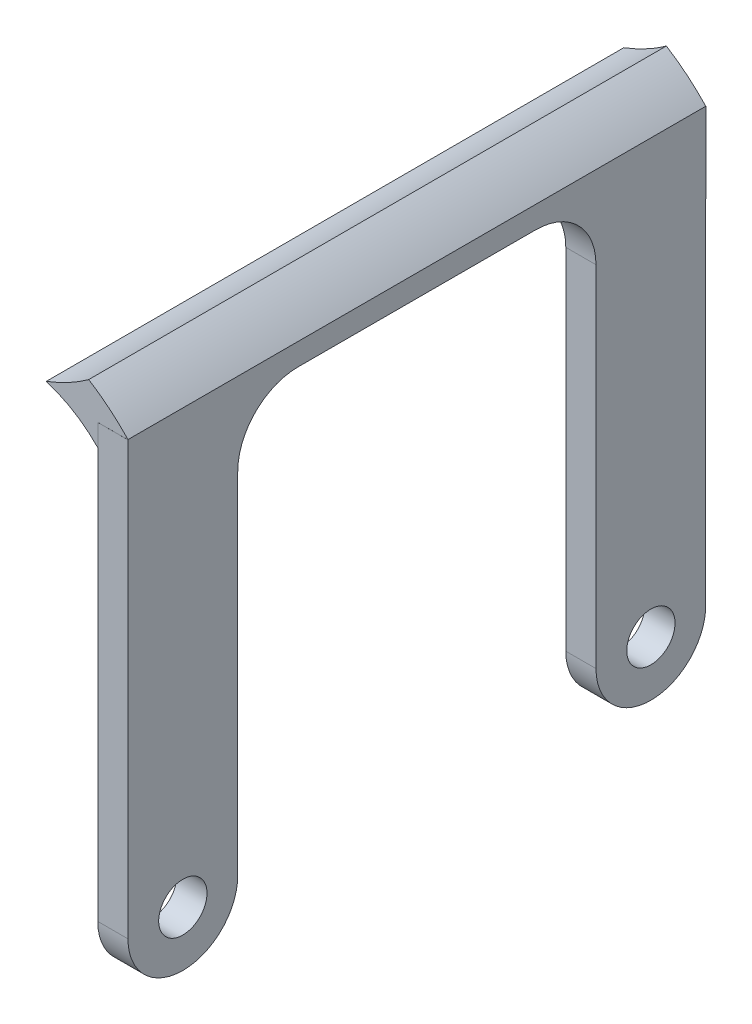
ISO-10303-21;
HEADER;
FILE_DESCRIPTION(('STEP AP214'),'2;1');
FILE_NAME('part.step','',(''),(''),'','','');
FILE_SCHEMA(('AUTOMOTIVE_DESIGN { 1 0 10303 214 1 1 1 1 }'));
ENDSEC;
DATA;
#1=APPLICATION_CONTEXT('core data for automotive mechanical design processes');
#2=APPLICATION_PROTOCOL_DEFINITION('international standard','automotive_design',2000,#1);
#3=PRODUCT_CONTEXT('',#1,'mechanical');
#4=PRODUCT('Part','Part','',(#3));
#5=PRODUCT_RELATED_PRODUCT_CATEGORY('part','',(#4));
#6=PRODUCT_DEFINITION_FORMATION('','',#4);
#7=PRODUCT_DEFINITION_CONTEXT('part definition',#1,'design');
#8=PRODUCT_DEFINITION('design','',#6,#7);
#9=PRODUCT_DEFINITION_SHAPE('','',#8);
#10=(LENGTH_UNIT() NAMED_UNIT(*) SI_UNIT(.MILLI.,.METRE.));
#11=(NAMED_UNIT(*) PLANE_ANGLE_UNIT() SI_UNIT($,.RADIAN.));
#12=(NAMED_UNIT(*) SI_UNIT($,.STERADIAN.) SOLID_ANGLE_UNIT());
#13=UNCERTAINTY_MEASURE_WITH_UNIT(LENGTH_MEASURE(1.E-05),#10,'distance_accuracy_value','');
#14=(GEOMETRIC_REPRESENTATION_CONTEXT(3) GLOBAL_UNCERTAINTY_ASSIGNED_CONTEXT((#13)) GLOBAL_UNIT_ASSIGNED_CONTEXT((#10,
#11,#12)) REPRESENTATION_CONTEXT('',''));
#15=CARTESIAN_POINT('',(0.,0.,0.));
#16=DIRECTION('',(0.,0.,1.));
#17=DIRECTION('',(1.,0.,0.));
#18=AXIS2_PLACEMENT_3D('',#15,#16,#17);
#19=CARTESIAN_POINT('',(0.,0.,45.));
#20=DIRECTION('',(0.,0.,-1.));
#21=DIRECTION('',(-1.,0.,0.));
#22=AXIS2_PLACEMENT_3D('',#19,#20,#21);
#23=CYLINDRICAL_SURFACE('',#22,12.);
#24=CARTESIAN_POINT('',(7.02498383519469,-9.72880302073987,3.36314771253102));
#25=CARTESIAN_POINT('',(7.02723049262112,-9.72718058034893,11.3631472325452));
#26=CARTESIAN_POINT('',(7.0294756204064,-9.72555812868285,19.3631467529861));
#27=CARTESIAN_POINT('',(7.03305322480976,-9.72297097617606,32.1198133545629));
#28=CARTESIAN_POINT('',(7.0343866902958,-9.72200628262441,36.8764804354229));
#29=CARTESIAN_POINT('',(7.03571961500865,-9.72104158508667,41.6331475164338));
#30=B_SPLINE_CURVE_WITH_KNOTS('',3,(#24,#25,#26,#27,#28,#29),.UNSPECIFIED.,.F.,.F.,(4,2,4),(0.,
24.0000000000005,38.2700020967807),.UNSPECIFIED.);
#31=CARTESIAN_POINT('',(7.02498360255062,-9.72880287516892,3.36314771247591));
#32=VERTEX_POINT('',#31);
#33=CARTESIAN_POINT('',(7.03571984585373,-9.72104172984277,41.6331475163984));
#34=VERTEX_POINT('',#33);
#35=EDGE_CURVE('E256',#32,#34,#30,.T.);
#36=ORIENTED_EDGE('',*,*,#35,.F.);
#37=CARTESIAN_POINT('',(0.,0.,3.35946508146585));
#38=DIRECTION('',(0.,0.000378528663133396,0.999999928358023));
#39=DIRECTION('',(0.,0.999999928358023,-0.000378528663133396));
#40=AXIS2_PLACEMENT_3D('',#37,#38,#39);
#41=ELLIPSE('',#40,12.0000008597038,12.);
#42=CARTESIAN_POINT('',(4.19954878426392,-11.2411649755969,3.36372018492097));
#43=VERTEX_POINT('',#42);
#44=EDGE_CURVE('E11',#32,#43,#41,.F.);
#45=ORIENTED_EDGE('',*,*,#44,.T.);
#46=CARTESIAN_POINT('',(4.22082501140202,-11.2331939469583,41.6337199093966));
#47=CARTESIAN_POINT('',(4.2178458420291,-11.2343131549428,36.2549856274687));
#48=CARTESIAN_POINT('',(4.21486197520819,-11.2354328251756,30.8762513482478));
#49=CARTESIAN_POINT('',(4.2077740403963,-11.23808942724,18.1195847711701));
#50=CARTESIAN_POINT('',(4.20366583150458,-11.2396267665534,10.7416524756996));
#51=CARTESIAN_POINT('',(4.19954878426414,-11.2411649755969,3.36372018532252));
#52=B_SPLINE_CURVE_WITH_KNOTS('',3,(#46,#47,#48,#49,#50,#51),.UNSPECIFIED.,.F.,.F.,(4,2,4),(0.,
16.1362056702403,38.2700064684776),.UNSPECIFIED.);
#53=CARTESIAN_POINT('',(4.22082501140202,-11.2331939469583,41.6337199093966));
#54=VERTEX_POINT('',#53);
#55=EDGE_CURVE('E50',#54,#43,#52,.T.);
#56=ORIENTED_EDGE('',*,*,#55,.F.);
#57=CARTESIAN_POINT('',(0.,0.,41.6294678232045));
#58=DIRECTION('',(0.,0.000378528663133396,0.999999928358023));
#59=DIRECTION('',(0.,0.999999928358023,-0.000378528663133396));
#60=AXIS2_PLACEMENT_3D('',#57,#58,#59);
#61=ELLIPSE('',#60,12.0000008597038,12.);
#62=EDGE_CURVE('E38',#34,#54,#61,.F.);
#63=ORIENTED_EDGE('',*,*,#62,.F.);
#64=EDGE_LOOP('',(#36,#45,#56,#63));
#65=FACE_BOUND('',#64,.T.);
#66=ADVANCED_FACE('F34',(#65),#23,.F.);
#67=CARTESIAN_POINT('',(0.0730357292681935,-20.8245636403161,41.6373505180044));
#68=DIRECTION('',(0.,-0.000378528663133396,-0.999999928358023));
#69=DIRECTION('',(0.,0.999999928358023,-0.000378528663133396));
#70=AXIS2_PLACEMENT_3D('',#67,#68,#69);
#71=CYLINDRICAL_SURFACE('',#70,13.1059981149448);
#72=CARTESIAN_POINT('',(0.0730357292681935,-20.8390499322542,3.36735325974281));
#73=DIRECTION('',(0.,-0.000378528663133396,-0.999999928358023));
#74=DIRECTION('',(0.,-0.999999928358023,0.000378528663133396));
#75=AXIS2_PLACEMENT_3D('',#72,#73,#74);
#76=CIRCLE('',#75,13.1059981149448);
#77=CARTESIAN_POINT('',(9.63633012475503,-11.8774331480479,3.36396103067894));
#78=VERTEX_POINT('',#77);
#79=EDGE_CURVE('E170',#32,#78,#76,.T.);
#80=ORIENTED_EDGE('',*,*,#79,.F.);
#81=ORIENTED_EDGE('',*,*,#35,.T.);
#82=CARTESIAN_POINT('',(0.0730357292681935,-20.8245636403161,41.6373505180044));
#83=DIRECTION('',(0.,-0.000378528663133396,-0.999999928358023));
#84=DIRECTION('',(0.,-0.999999928358023,0.000378528663133396));
#85=AXIS2_PLACEMENT_3D('',#82,#83,#84);
#86=CIRCLE('',#85,13.1059981149448);
#87=CARTESIAN_POINT('',(9.63633012475503,-11.8629468561098,41.6339582889405));
#88=VERTEX_POINT('',#87);
#89=EDGE_CURVE('E171',#34,#88,#86,.T.);
#90=ORIENTED_EDGE('',*,*,#89,.T.);
#91=DIRECTION('',(0.,-0.000378528663133396,-0.999999928358023));
#92=VECTOR('',#91,1.);
#93=CARTESIAN_POINT('',(9.63633012475503,-11.8629468561098,41.6339582889405));
#94=LINE('',#93,#92);
#95=EDGE_CURVE('E179',#88,#78,#94,.T.);
#96=ORIENTED_EDGE('',*,*,#95,.T.);
#97=EDGE_LOOP('',(#80,#81,#90,#96));
#98=FACE_BOUND('',#97,.T.);
#99=ADVANCED_FACE('F268',(#98),#71,.T.);
#100=CARTESIAN_POINT('',(1.8478331682223,-18.9444314968007,41.6366388340466));
#101=DIRECTION('',(0.,-0.000378528663133396,-0.999999928358023));
#102=DIRECTION('',(0.,0.999999928358023,-0.000378528663133396));
#103=AXIS2_PLACEMENT_3D('',#100,#101,#102);
#104=CYLINDRICAL_SURFACE('',#103,8.06810283511668);
#105=CARTESIAN_POINT('',(1.8478331682223,-18.9444314968007,41.6366388340466));
#106=DIRECTION('',(0.,0.000378528663133396,0.999999928358023));
#107=DIRECTION('',(0.,0.999999928358023,-0.000378528663133396));
#108=AXIS2_PLACEMENT_3D('',#105,#106,#107);
#109=CIRCLE('',#108,8.06810283511668);
#110=CARTESIAN_POINT('',(7.63633012475503,-13.3241484241935,41.6345113956562));
#111=VERTEX_POINT('',#110);
#112=EDGE_CURVE('E177',#111,#54,#109,.T.);
#113=ORIENTED_EDGE('',*,*,#112,.T.);
#114=ORIENTED_EDGE('',*,*,#55,.T.);
#115=CARTESIAN_POINT('',(1.8478331682223,-18.9589177887388,3.36664157578502));
#116=DIRECTION('',(0.,0.000378528663133396,0.999999928358023));
#117=DIRECTION('',(0.,0.999999928358023,-0.000378528663133396));
#118=AXIS2_PLACEMENT_3D('',#115,#116,#117);
#119=CIRCLE('',#118,8.06810283511668);
#120=CARTESIAN_POINT('',(7.63633012475503,-13.3386347161316,3.3645141373947));
#121=VERTEX_POINT('',#120);
#122=EDGE_CURVE('E174',#121,#43,#119,.T.);
#123=ORIENTED_EDGE('',*,*,#122,.F.);
#124=DIRECTION('',(0.,-0.000378528663133396,-0.999999928358023));
#125=VECTOR('',#124,1.);
#126=CARTESIAN_POINT('',(7.63633012475503,-13.3241484241935,41.6345113956562));
#127=LINE('',#126,#125);
#128=CARTESIAN_POINT('',(7.63633012475503,-13.3343686937357,14.6345248546686));
#129=VERTEX_POINT('',#128);
#130=EDGE_CURVE('E144',#121,#129,#127,.F.);
#131=ORIENTED_EDGE('',*,*,#130,.T.);
#132=DIRECTION('',(0.,-0.000378528663133396,-0.999999928358023));
#133=VECTOR('',#132,1.);
#134=CARTESIAN_POINT('',(7.63633012475503,-13.3241484241935,41.6345113956562));
#135=LINE('',#134,#133);
#136=CARTESIAN_POINT('',(7.63633012475503,-13.3284152239974,30.3624469160264));
#137=VERTEX_POINT('',#136);
#138=EDGE_CURVE('E186',#137,#129,#135,.T.);
#139=ORIENTED_EDGE('',*,*,#138,.F.);
#140=EDGE_CURVE('E183',#111,#137,#135,.T.);
#141=ORIENTED_EDGE('',*,*,#140,.F.);
#142=EDGE_LOOP('',(#113,#114,#123,#131,#139,#141));
#143=FACE_BOUND('',#142,.T.);
#144=ADVANCED_FACE('F262',(#143),#104,.F.);
#145=CARTESIAN_POINT('',(9.63633012475503,-13.3241484241935,41.6345113956562));
#146=DIRECTION('',(0.,-0.999999928358023,0.000378528663133396));
#147=DIRECTION('',(0.,-0.000378528663133396,-0.999999928358023));
#148=AXIS2_PLACEMENT_3D('',#145,#146,#147);
#149=PLANE('',#148);
#150=ORIENTED_EDGE('',*,*,#138,.T.);
#151=DIRECTION('',(1.,0.,0.));
#152=VECTOR('',#151,1.);
#153=CARTESIAN_POINT('',(9.63633012475503,-13.3343686937357,14.6345248546686));
#154=LINE('',#153,#152);
#155=CARTESIAN_POINT('',(9.63633012475503,-13.3343686937357,14.6345248546686));
#156=VERTEX_POINT('',#155);
#157=EDGE_CURVE('E235',#129,#156,#154,.T.);
#158=ORIENTED_EDGE('',*,*,#157,.T.);
#159=DIRECTION('',(0.,-0.000378528663133396,-0.999999928358023));
#160=VECTOR('',#159,1.);
#161=CARTESIAN_POINT('',(9.63633012475503,-13.3241484241935,41.6345113956562));
#162=LINE('',#161,#160);
#163=CARTESIAN_POINT('',(9.63633012475503,-13.3284152239974,30.3624469160264));
#164=VERTEX_POINT('',#163);
#165=EDGE_CURVE('E187',#164,#156,#162,.T.);
#166=ORIENTED_EDGE('',*,*,#165,.F.);
#167=DIRECTION('',(1.,0.,0.));
#168=VECTOR('',#167,1.);
#169=CARTESIAN_POINT('',(9.63633012475503,-13.3284152239974,30.3624469160264));
#170=LINE('',#169,#168);
#171=EDGE_CURVE('E232',#164,#137,#170,.F.);
#172=ORIENTED_EDGE('',*,*,#171,.T.);
#173=EDGE_LOOP('',(#150,#158,#166,#172));
#174=FACE_BOUND('',#173,.T.);
#175=ADVANCED_FACE('F267',(#174),#149,.T.);
#176=CARTESIAN_POINT('',(9.63633012475503,-40.5,38.));
#177=DIRECTION('',(-1.,0.,0.));
#178=DIRECTION('',(0.,0.,1.));
#179=AXIS2_PLACEMENT_3D('',#176,#177,#178);
#180=CYLINDRICAL_SURFACE('',#179,3.63603896932107);
#181=DIRECTION('',(1.,0.,0.));
#182=VECTOR('',#181,1.);
#183=CARTESIAN_POINT('',(7.63633012475503,-40.5,34.3639610306789));
#184=LINE('',#183,#182);
#185=CARTESIAN_POINT('',(7.63633012475503,-40.5,34.3639610306789));
#186=VERTEX_POINT('',#185);
#187=CARTESIAN_POINT('',(9.63633012475503,-40.5,34.3639610306789));
#188=VERTEX_POINT('',#187);
#189=EDGE_CURVE('E209',#186,#188,#184,.T.);
#190=ORIENTED_EDGE('',*,*,#189,.T.);
#191=CARTESIAN_POINT('',(9.63633012475503,-40.5,38.));
#192=DIRECTION('',(1.,0.,0.));
#193=DIRECTION('',(0.,0.,-1.));
#194=AXIS2_PLACEMENT_3D('',#191,#192,#193);
#195=CIRCLE('',#194,3.63603896932107);
#196=CARTESIAN_POINT('',(9.63633012475503,-40.5,41.6360389693211));
#197=VERTEX_POINT('',#196);
#198=EDGE_CURVE('E224',#197,#188,#195,.T.);
#199=ORIENTED_EDGE('',*,*,#198,.F.);
#200=DIRECTION('',(1.,0.,0.));
#201=VECTOR('',#200,1.);
#202=CARTESIAN_POINT('',(7.63633012475503,-40.5,41.6360389693211));
#203=LINE('',#202,#201);
#204=CARTESIAN_POINT('',(7.63633012475503,-40.5,41.6360389693211));
#205=VERTEX_POINT('',#204);
#206=EDGE_CURVE('E213',#205,#197,#203,.T.);
#207=ORIENTED_EDGE('',*,*,#206,.F.);
#208=CARTESIAN_POINT('',(7.63633012475503,-40.5,38.));
#209=DIRECTION('',(1.,0.,0.));
#210=DIRECTION('',(0.,0.,-1.));
#211=AXIS2_PLACEMENT_3D('',#208,#209,#210);
#212=CIRCLE('',#211,3.63603896932107);
#213=EDGE_CURVE('E221',#205,#186,#212,.T.);
#214=ORIENTED_EDGE('',*,*,#213,.T.);
#215=EDGE_LOOP('',(#190,#199,#207,#214));
#216=FACE_BOUND('',#215,.T.);
#217=ADVANCED_FACE('F271',(#216),#180,.T.);
#218=CARTESIAN_POINT('',(9.63633012475503,-40.5,38.));
#219=DIRECTION('',(1.,0.,0.));
#220=DIRECTION('',(0.,0.,-1.));
#221=AXIS2_PLACEMENT_3D('',#218,#219,#220);
#222=PLANE('',#221);
#223=DIRECTION('',(0.,-1.,0.));
#224=VECTOR('',#223,1.);
#225=CARTESIAN_POINT('',(9.63633012475503,0.,34.363961030679));
#226=LINE('',#225,#224);
#227=CARTESIAN_POINT('',(9.63633012475503,-17.3284149374295,34.363961030679));
#228=VERTEX_POINT('',#227);
#229=EDGE_CURVE('E194',#228,#188,#226,.T.);
#230=ORIENTED_EDGE('',*,*,#229,.F.);
#231=CARTESIAN_POINT('',(9.63633012475503,-17.3284149374295,30.363961030679));
#232=DIRECTION('',(1.,0.,0.));
#233=DIRECTION('',(0.,0.,-1.));
#234=AXIS2_PLACEMENT_3D('',#231,#232,#233);
#235=CIRCLE('',#234,4.);
#236=EDGE_CURVE('E247',#228,#164,#235,.F.);
#237=ORIENTED_EDGE('',*,*,#236,.T.);
#238=ORIENTED_EDGE('',*,*,#165,.T.);
#239=CARTESIAN_POINT('',(9.63633012475503,-17.3343684071678,14.6360389693211));
#240=DIRECTION('',(1.,0.,0.));
#241=DIRECTION('',(0.,0.,-1.));
#242=AXIS2_PLACEMENT_3D('',#239,#240,#241);
#243=CIRCLE('',#242,4.);
#244=CARTESIAN_POINT('',(9.63633012475503,-17.3343684071678,10.6360389693211));
#245=VERTEX_POINT('',#244);
#246=EDGE_CURVE('E243',#156,#245,#243,.F.);
#247=ORIENTED_EDGE('',*,*,#246,.T.);
#248=DIRECTION('',(0.,1.,0.));
#249=VECTOR('',#248,1.);
#250=CARTESIAN_POINT('',(9.63633012475503,0.,10.6360389693211));
#251=LINE('',#250,#249);
#252=CARTESIAN_POINT('',(9.63633012475503,-40.5,10.6360389693211));
#253=VERTEX_POINT('',#252);
#254=EDGE_CURVE('E146',#253,#245,#251,.T.);
#255=ORIENTED_EDGE('',*,*,#254,.F.);
#256=CARTESIAN_POINT('',(9.63633012475503,-40.5,7.00000000000001));
#257=DIRECTION('',(1.,0.,0.));
#258=DIRECTION('',(0.,0.,-1.));
#259=AXIS2_PLACEMENT_3D('',#256,#257,#258);
#260=CIRCLE('',#259,3.63603896932107);
#261=CARTESIAN_POINT('',(9.63633012475503,-40.2208841981938,3.37468984008217));
#262=VERTEX_POINT('',#261);
#263=EDGE_CURVE('E160',#253,#262,#260,.T.);
#264=ORIENTED_EDGE('',*,*,#263,.T.);
#265=DIRECTION('',(0.,-0.999999928358023,0.000378528663133628));
#266=VECTOR('',#265,1.);
#267=CARTESIAN_POINT('',(9.63633012475503,-11.8774331480479,3.36396103067894));
#268=LINE('',#267,#266);
#269=EDGE_CURVE('E152',#78,#262,#268,.T.);
#270=ORIENTED_EDGE('',*,*,#269,.F.);
#271=ORIENTED_EDGE('',*,*,#95,.F.);
#272=DIRECTION('',(0.,-0.999999928358023,0.000378528663133628));
#273=VECTOR('',#272,1.);
#274=CARTESIAN_POINT('',(9.63633012475503,-11.8629468561098,41.6339582889405));
#275=LINE('',#274,#273);
#276=CARTESIAN_POINT('',(9.63633012475503,-11.8774331480479,41.6339637724176));
#277=VERTEX_POINT('',#276);
#278=EDGE_CURVE('E173',#88,#277,#275,.T.);
#279=ORIENTED_EDGE('',*,*,#278,.T.);
#280=DIRECTION('',(0.,0.,-1.));
#281=VECTOR('',#280,1.);
#282=CARTESIAN_POINT('',(9.63633012475503,-11.8774331480479,0.));
#283=LINE('',#282,#281);
#284=CARTESIAN_POINT('',(9.63633012475503,-11.8774331480479,41.6360389693211));
#285=VERTEX_POINT('',#284);
#286=EDGE_CURVE('E205',#285,#277,#283,.T.);
#287=ORIENTED_EDGE('',*,*,#286,.F.);
#288=DIRECTION('',(0.,1.,0.));
#289=VECTOR('',#288,1.);
#290=CARTESIAN_POINT('',(9.63633012475503,0.,41.6360389693211));
#291=LINE('',#290,#289);
#292=EDGE_CURVE('E198',#197,#285,#291,.T.);
#293=ORIENTED_EDGE('',*,*,#292,.F.);
#294=ORIENTED_EDGE('',*,*,#198,.T.);
#295=EDGE_LOOP('',(#230,#237,#238,#247,#255,#264,#270,#271,#279,#287,#293,#294));
#296=FACE_BOUND('',#295,.T.);
#297=CARTESIAN_POINT('',(9.63633012475503,-40.5,7.00000000000001));
#298=DIRECTION('',(1.,0.,0.));
#299=DIRECTION('',(0.,0.,-1.));
#300=AXIS2_PLACEMENT_3D('',#297,#298,#299);
#301=CIRCLE('',#300,1.6);
#302=CARTESIAN_POINT('',(9.63633012475503,-40.5,5.40000000000001));
#303=VERTEX_POINT('',#302);
#304=EDGE_CURVE('E161',#303,#303,#301,.T.);
#305=ORIENTED_EDGE('',*,*,#304,.F.);
#306=EDGE_LOOP('',(#305));
#307=FACE_BOUND('',#306,.T.);
#308=CARTESIAN_POINT('',(9.63633012475503,-40.5,38.));
#309=DIRECTION('',(1.,0.,0.));
#310=DIRECTION('',(0.,0.,-1.));
#311=AXIS2_PLACEMENT_3D('',#308,#309,#310);
#312=CIRCLE('',#311,1.6);
#313=CARTESIAN_POINT('',(9.63633012475503,-40.5,36.4));
#314=VERTEX_POINT('',#313);
#315=EDGE_CURVE('E218',#314,#314,#312,.T.);
#316=ORIENTED_EDGE('',*,*,#315,.F.);
#317=EDGE_LOOP('',(#316));
#318=FACE_BOUND('',#317,.T.);
#319=ADVANCED_FACE('F295',(#296,#307,#318),#222,.T.);
#320=CARTESIAN_POINT('',(7.63633012475503,-40.5,38.));
#321=DIRECTION('',(1.,0.,0.));
#322=DIRECTION('',(0.,0.,-1.));
#323=AXIS2_PLACEMENT_3D('',#320,#321,#322);
#324=PLANE('',#323);
#325=DIRECTION('',(0.,-0.999999928358023,0.000378528663133396));
#326=VECTOR('',#325,1.);
#327=CARTESIAN_POINT('',(7.63633012475503,-40.4986203394955,41.6447977129186));
#328=LINE('',#327,#326);
#329=CARTESIAN_POINT('',(7.63633012475503,-11.8774331480479,41.6339637724176));
#330=VERTEX_POINT('',#329);
#331=EDGE_CURVE('E185',#330,#111,#328,.T.);
#332=ORIENTED_EDGE('',*,*,#331,.T.);
#333=ORIENTED_EDGE('',*,*,#140,.T.);
#334=CARTESIAN_POINT('',(7.63633012475503,-17.3284149374295,30.363961030679));
#335=DIRECTION('',(1.,0.,0.));
#336=DIRECTION('',(0.,0.,-1.));
#337=AXIS2_PLACEMENT_3D('',#334,#335,#336);
#338=CIRCLE('',#337,4.);
#339=CARTESIAN_POINT('',(7.63633012475503,-17.3284149374295,34.363961030679));
#340=VERTEX_POINT('',#339);
#341=EDGE_CURVE('E249',#137,#340,#338,.T.);
#342=ORIENTED_EDGE('',*,*,#341,.T.);
#343=DIRECTION('',(0.,-1.,0.));
#344=VECTOR('',#343,1.);
#345=CARTESIAN_POINT('',(7.63633012475503,0.,34.363961030679));
#346=LINE('',#345,#344);
#347=EDGE_CURVE('E195',#340,#186,#346,.T.);
#348=ORIENTED_EDGE('',*,*,#347,.T.);
#349=ORIENTED_EDGE('',*,*,#213,.F.);
#350=DIRECTION('',(0.,1.,0.));
#351=VECTOR('',#350,1.);
#352=CARTESIAN_POINT('',(7.63633012475503,0.,41.6360389693211));
#353=LINE('',#352,#351);
#354=CARTESIAN_POINT('',(7.63633012475503,-11.8774331480479,41.6360389693211));
#355=VERTEX_POINT('',#354);
#356=EDGE_CURVE('E201',#205,#355,#353,.T.);
#357=ORIENTED_EDGE('',*,*,#356,.T.);
#358=DIRECTION('',(0.,0.,-1.));
#359=VECTOR('',#358,1.);
#360=CARTESIAN_POINT('',(7.63633012475503,-11.8774331480479,0.));
#361=LINE('',#360,#359);
#362=EDGE_CURVE('E197',#355,#330,#361,.T.);
#363=ORIENTED_EDGE('',*,*,#362,.T.);
#364=EDGE_LOOP('',(#332,#333,#342,#348,#349,#357,#363));
#365=FACE_BOUND('',#364,.T.);
#366=CARTESIAN_POINT('',(7.63633012475503,-40.5,38.));
#367=DIRECTION('',(1.,0.,0.));
#368=DIRECTION('',(0.,0.,-1.));
#369=AXIS2_PLACEMENT_3D('',#366,#367,#368);
#370=CIRCLE('',#369,1.6);
#371=CARTESIAN_POINT('',(7.63633012475503,-40.5,36.4));
#372=VERTEX_POINT('',#371);
#373=EDGE_CURVE('E212',#372,#372,#370,.T.);
#374=ORIENTED_EDGE('',*,*,#373,.T.);
#375=EDGE_LOOP('',(#374));
#376=FACE_BOUND('',#375,.T.);
#377=ADVANCED_FACE('F293',(#365,#376),#324,.F.);
#378=CARTESIAN_POINT('',(9.63633012475503,-40.5,38.));
#379=DIRECTION('',(-1.,0.,0.));
#380=DIRECTION('',(0.,0.,1.));
#381=AXIS2_PLACEMENT_3D('',#378,#379,#380);
#382=CYLINDRICAL_SURFACE('',#381,1.6);
#383=ORIENTED_EDGE('',*,*,#315,.T.);
#384=EDGE_LOOP('',(#383));
#385=FACE_BOUND('',#384,.T.);
#386=ORIENTED_EDGE('',*,*,#373,.F.);
#387=EDGE_LOOP('',(#386));
#388=FACE_BOUND('',#387,.T.);
#389=ADVANCED_FACE('F289',(#385,#388),#382,.F.);
#390=CARTESIAN_POINT('',(7.63633012475503,0.,34.363961030679));
#391=DIRECTION('',(0.,0.,1.));
#392=DIRECTION('',(0.,-1.,0.));
#393=AXIS2_PLACEMENT_3D('',#390,#391,#392);
#394=PLANE('',#393);
#395=ORIENTED_EDGE('',*,*,#347,.F.);
#396=DIRECTION('',(1.,0.,0.));
#397=VECTOR('',#396,1.);
#398=CARTESIAN_POINT('',(7.63633012475503,-17.3284149374295,34.363961030679));
#399=LINE('',#398,#397);
#400=EDGE_CURVE('E240',#340,#228,#399,.T.);
#401=ORIENTED_EDGE('',*,*,#400,.T.);
#402=ORIENTED_EDGE('',*,*,#229,.T.);
#403=ORIENTED_EDGE('',*,*,#189,.F.);
#404=EDGE_LOOP('',(#395,#401,#402,#403));
#405=FACE_BOUND('',#404,.T.);
#406=ADVANCED_FACE('F281',(#405),#394,.F.);
#407=CARTESIAN_POINT('',(7.63633012475503,0.,41.6360389693211));
#408=DIRECTION('',(0.,0.,-1.));
#409=DIRECTION('',(-1.,0.,0.));
#410=AXIS2_PLACEMENT_3D('',#407,#408,#409);
#411=PLANE('',#410);
#412=ORIENTED_EDGE('',*,*,#292,.T.);
#413=DIRECTION('',(1.,0.,0.));
#414=VECTOR('',#413,1.);
#415=CARTESIAN_POINT('',(7.63633012475503,-11.8774331480479,41.6360389693211));
#416=LINE('',#415,#414);
#417=EDGE_CURVE('E203',#355,#285,#416,.T.);
#418=ORIENTED_EDGE('',*,*,#417,.F.);
#419=ORIENTED_EDGE('',*,*,#356,.F.);
#420=ORIENTED_EDGE('',*,*,#206,.T.);
#421=EDGE_LOOP('',(#412,#418,#419,#420));
#422=FACE_BOUND('',#421,.T.);
#423=ADVANCED_FACE('F277',(#422),#411,.F.);
#424=CARTESIAN_POINT('',(7.63633012475503,-11.8774331480479,0.));
#425=DIRECTION('',(0.,-1.,0.));
#426=DIRECTION('',(0.,0.,-1.));
#427=AXIS2_PLACEMENT_3D('',#424,#425,#426);
#428=PLANE('',#427);
#429=ORIENTED_EDGE('',*,*,#286,.T.);
#430=DIRECTION('',(-1.,0.,0.));
#431=VECTOR('',#430,1.);
#432=CARTESIAN_POINT('',(7.63633012475503,-11.8774331480479,41.6339637724176));
#433=LINE('',#432,#431);
#434=EDGE_CURVE('E227',#277,#330,#433,.T.);
#435=ORIENTED_EDGE('',*,*,#434,.T.);
#436=ORIENTED_EDGE('',*,*,#362,.F.);
#437=ORIENTED_EDGE('',*,*,#417,.T.);
#438=EDGE_LOOP('',(#429,#435,#436,#437));
#439=FACE_BOUND('',#438,.T.);
#440=ADVANCED_FACE('F280',(#439),#428,.F.);
#441=CARTESIAN_POINT('',(0.0730357292681935,-20.8245636403161,41.6373505180044));
#442=DIRECTION('',(0.,0.000378528663133396,0.999999928358023));
#443=DIRECTION('',(0.,-0.999999928358023,0.000378528663133396));
#444=AXIS2_PLACEMENT_3D('',#441,#442,#443);
#445=PLANE('',#444);
#446=ORIENTED_EDGE('',*,*,#89,.F.);
#447=ORIENTED_EDGE('',*,*,#62,.T.);
#448=ORIENTED_EDGE('',*,*,#112,.F.);
#449=ORIENTED_EDGE('',*,*,#331,.F.);
#450=ORIENTED_EDGE('',*,*,#434,.F.);
#451=ORIENTED_EDGE('',*,*,#278,.F.);
#452=EDGE_LOOP('',(#446,#447,#448,#449,#450,#451));
#453=FACE_BOUND('',#452,.T.);
#454=ADVANCED_FACE('F285',(#453),#445,.T.);
#455=CARTESIAN_POINT('',(0.0730357292681935,-20.8390499322542,3.36735325974281));
#456=DIRECTION('',(0.,0.000378528663133396,0.999999928358023));
#457=DIRECTION('',(0.,-0.999999928358023,0.000378528663133396));
#458=AXIS2_PLACEMENT_3D('',#455,#456,#457);
#459=PLANE('',#458);
#460=ORIENTED_EDGE('',*,*,#44,.F.);
#461=ORIENTED_EDGE('',*,*,#79,.T.);
#462=ORIENTED_EDGE('',*,*,#269,.T.);
#463=DIRECTION('',(1.,0.,0.));
#464=VECTOR('',#463,1.);
#465=CARTESIAN_POINT('',(7.63633012475503,-40.2208841981938,3.37468984008217));
#466=LINE('',#465,#464);
#467=CARTESIAN_POINT('',(7.63633012475503,-40.2208841981938,3.37468984008217));
#468=VERTEX_POINT('',#467);
#469=EDGE_CURVE('E149',#468,#262,#466,.T.);
#470=ORIENTED_EDGE('',*,*,#469,.F.);
#471=DIRECTION('',(0.,-0.999999928358023,0.000378528663133396));
#472=VECTOR('',#471,1.);
#473=CARTESIAN_POINT('',(7.63633012475503,0.0012716537350268,3.35946460010843));
#474=LINE('',#473,#472);
#475=EDGE_CURVE('E136',#121,#468,#474,.T.);
#476=ORIENTED_EDGE('',*,*,#475,.F.);
#477=ORIENTED_EDGE('',*,*,#122,.T.);
#478=EDGE_LOOP('',(#460,#461,#462,#470,#476,#477));
#479=FACE_BOUND('',#478,.T.);
#480=ADVANCED_FACE('F150',(#479),#459,.F.);
#481=CARTESIAN_POINT('',(7.63633012475503,0.,10.6360389693211));
#482=DIRECTION('',(0.,0.,-1.));
#483=DIRECTION('',(-1.,0.,0.));
#484=AXIS2_PLACEMENT_3D('',#481,#482,#483);
#485=PLANE('',#484);
#486=ORIENTED_EDGE('',*,*,#254,.T.);
#487=DIRECTION('',(1.,0.,0.));
#488=VECTOR('',#487,1.);
#489=CARTESIAN_POINT('',(7.63633012475503,-17.3343684071678,10.6360389693211));
#490=LINE('',#489,#488);
#491=CARTESIAN_POINT('',(7.63633012475503,-17.3343684071678,10.6360389693211));
#492=VERTEX_POINT('',#491);
#493=EDGE_CURVE('E238',#245,#492,#490,.F.);
#494=ORIENTED_EDGE('',*,*,#493,.T.);
#495=DIRECTION('',(0.,1.,0.));
#496=VECTOR('',#495,1.);
#497=CARTESIAN_POINT('',(7.63633012475503,0.,10.6360389693211));
#498=LINE('',#497,#496);
#499=CARTESIAN_POINT('',(7.63633012475503,-40.5,10.6360389693211));
#500=VERTEX_POINT('',#499);
#501=EDGE_CURVE('E145',#500,#492,#498,.T.);
#502=ORIENTED_EDGE('',*,*,#501,.F.);
#503=DIRECTION('',(1.,0.,0.));
#504=VECTOR('',#503,1.);
#505=CARTESIAN_POINT('',(7.63633012475503,-40.5,10.6360389693211));
#506=LINE('',#505,#504);
#507=EDGE_CURVE('E156',#500,#253,#506,.T.);
#508=ORIENTED_EDGE('',*,*,#507,.T.);
#509=EDGE_LOOP('',(#486,#494,#502,#508));
#510=FACE_BOUND('',#509,.T.);
#511=ADVANCED_FACE('F348',(#510),#485,.F.);
#512=CARTESIAN_POINT('',(7.63633012475503,-40.5,7.00000000000001));
#513=DIRECTION('',(1.,0.,0.));
#514=DIRECTION('',(0.,0.,-1.));
#515=AXIS2_PLACEMENT_3D('',#512,#513,#514);
#516=PLANE('',#515);
#517=ORIENTED_EDGE('',*,*,#130,.F.);
#518=ORIENTED_EDGE('',*,*,#475,.T.);
#519=CARTESIAN_POINT('',(7.63633012475503,-40.5,7.00000000000001));
#520=DIRECTION('',(1.,0.,0.));
#521=DIRECTION('',(0.,0.,-1.));
#522=AXIS2_PLACEMENT_3D('',#519,#520,#521);
#523=CIRCLE('',#522,3.63603896932107);
#524=EDGE_CURVE('E142',#500,#468,#523,.T.);
#525=ORIENTED_EDGE('',*,*,#524,.F.);
#526=ORIENTED_EDGE('',*,*,#501,.T.);
#527=CARTESIAN_POINT('',(7.63633012475503,-17.3343684071678,14.6360389693211));
#528=DIRECTION('',(1.,0.,0.));
#529=DIRECTION('',(0.,0.,-1.));
#530=AXIS2_PLACEMENT_3D('',#527,#528,#529);
#531=CIRCLE('',#530,4.);
#532=EDGE_CURVE('E245',#492,#129,#531,.T.);
#533=ORIENTED_EDGE('',*,*,#532,.T.);
#534=EDGE_LOOP('',(#517,#518,#525,#526,#533));
#535=FACE_BOUND('',#534,.T.);
#536=CARTESIAN_POINT('',(7.63633012475503,-40.5,7.00000000000001));
#537=DIRECTION('',(1.,0.,0.));
#538=DIRECTION('',(0.,0.,-1.));
#539=AXIS2_PLACEMENT_3D('',#536,#537,#538);
#540=CIRCLE('',#539,1.6);
#541=CARTESIAN_POINT('',(7.63633012475503,-40.5,5.40000000000001));
#542=VERTEX_POINT('',#541);
#543=EDGE_CURVE('E165',#542,#542,#540,.T.);
#544=ORIENTED_EDGE('',*,*,#543,.T.);
#545=EDGE_LOOP('',(#544));
#546=FACE_BOUND('',#545,.T.);
#547=ADVANCED_FACE('F138',(#535,#546),#516,.F.);
#548=CARTESIAN_POINT('',(9.63633012475503,-40.5,7.00000000000001));
#549=DIRECTION('',(-1.,0.,0.));
#550=DIRECTION('',(0.,0.,1.));
#551=AXIS2_PLACEMENT_3D('',#548,#549,#550);
#552=CYLINDRICAL_SURFACE('',#551,3.63603896932107);
#553=ORIENTED_EDGE('',*,*,#263,.F.);
#554=ORIENTED_EDGE('',*,*,#507,.F.);
#555=ORIENTED_EDGE('',*,*,#524,.T.);
#556=ORIENTED_EDGE('',*,*,#469,.T.);
#557=EDGE_LOOP('',(#553,#554,#555,#556));
#558=FACE_BOUND('',#557,.T.);
#559=ADVANCED_FACE('F159',(#558),#552,.T.);
#560=CARTESIAN_POINT('',(9.63633012475503,-40.5,7.00000000000001));
#561=DIRECTION('',(-1.,0.,0.));
#562=DIRECTION('',(0.,0.,1.));
#563=AXIS2_PLACEMENT_3D('',#560,#561,#562);
#564=CYLINDRICAL_SURFACE('',#563,1.6);
#565=ORIENTED_EDGE('',*,*,#304,.T.);
#566=EDGE_LOOP('',(#565));
#567=FACE_BOUND('',#566,.T.);
#568=ORIENTED_EDGE('',*,*,#543,.F.);
#569=EDGE_LOOP('',(#568));
#570=FACE_BOUND('',#569,.T.);
#571=ADVANCED_FACE('F308',(#567,#570),#564,.F.);
#572=CARTESIAN_POINT('',(9.63633012475503,-17.3343684071678,14.6360389693211));
#573=DIRECTION('',(1.,0.,0.));
#574=DIRECTION('',(0.,0.,-1.));
#575=AXIS2_PLACEMENT_3D('',#572,#573,#574);
#576=CYLINDRICAL_SURFACE('',#575,4.);
#577=ORIENTED_EDGE('',*,*,#532,.F.);
#578=ORIENTED_EDGE('',*,*,#493,.F.);
#579=ORIENTED_EDGE('',*,*,#246,.F.);
#580=ORIENTED_EDGE('',*,*,#157,.F.);
#581=EDGE_LOOP('',(#577,#578,#579,#580));
#582=FACE_BOUND('',#581,.T.);
#583=ADVANCED_FACE('F305',(#582),#576,.F.);
#584=CARTESIAN_POINT('',(7.63633012475503,-17.3284149374295,30.363961030679));
#585=DIRECTION('',(1.,0.,0.));
#586=DIRECTION('',(0.,0.,-1.));
#587=AXIS2_PLACEMENT_3D('',#584,#585,#586);
#588=CYLINDRICAL_SURFACE('',#587,4.);
#589=ORIENTED_EDGE('',*,*,#341,.F.);
#590=ORIENTED_EDGE('',*,*,#171,.F.);
#591=ORIENTED_EDGE('',*,*,#236,.F.);
#592=ORIENTED_EDGE('',*,*,#400,.F.);
#593=EDGE_LOOP('',(#589,#590,#591,#592));
#594=FACE_BOUND('',#593,.T.);
#595=ADVANCED_FACE('F307',(#594),#588,.F.);
#596=CLOSED_SHELL('',(#66,#99,#144,#175,#217,#319,#377,#389,#406,#423,#440,#454,#480,#511,#547,
#559,#571,#583,#595));
#597=MANIFOLD_SOLID_BREP('B2',#596);
#598=ADVANCED_BREP_SHAPE_REPRESENTATION('',(#18,#597),#14);
#599=SHAPE_DEFINITION_REPRESENTATION(#9,#598);
ENDSEC;
END-ISO-10303-21;
